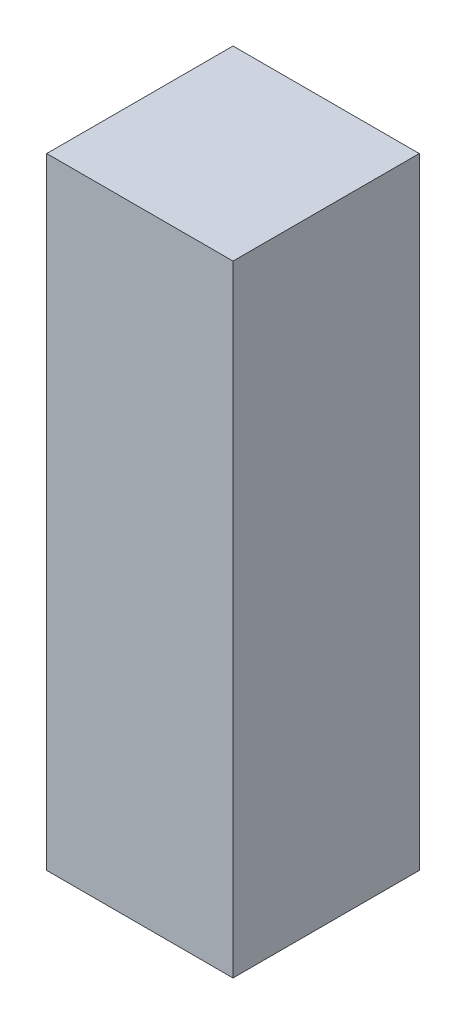
ISO-10303-21;
HEADER;
FILE_DESCRIPTION(('STEP AP214'),'2;1');
FILE_NAME('part.step','',(''),(''),'','','');
FILE_SCHEMA(('AUTOMOTIVE_DESIGN { 1 0 10303 214 1 1 1 1 }'));
ENDSEC;
DATA;
#1=APPLICATION_CONTEXT('core data for automotive mechanical design processes');
#2=APPLICATION_PROTOCOL_DEFINITION('international standard','automotive_design',2000,#1);
#3=PRODUCT_CONTEXT('',#1,'mechanical');
#4=PRODUCT('Part','Part','',(#3));
#5=PRODUCT_RELATED_PRODUCT_CATEGORY('part','',(#4));
#6=PRODUCT_DEFINITION_FORMATION('','',#4);
#7=PRODUCT_DEFINITION_CONTEXT('part definition',#1,'design');
#8=PRODUCT_DEFINITION('design','',#6,#7);
#9=PRODUCT_DEFINITION_SHAPE('','',#8);
#10=(LENGTH_UNIT() NAMED_UNIT(*) SI_UNIT(.MILLI.,.METRE.));
#11=(NAMED_UNIT(*) PLANE_ANGLE_UNIT() SI_UNIT($,.RADIAN.));
#12=(NAMED_UNIT(*) SI_UNIT($,.STERADIAN.) SOLID_ANGLE_UNIT());
#13=UNCERTAINTY_MEASURE_WITH_UNIT(LENGTH_MEASURE(1.E-05),#10,'distance_accuracy_value','');
#14=(GEOMETRIC_REPRESENTATION_CONTEXT(3) GLOBAL_UNCERTAINTY_ASSIGNED_CONTEXT((#13)) GLOBAL_UNIT_ASSIGNED_CONTEXT((#10,
#11,#12)) REPRESENTATION_CONTEXT('',''));
#15=CARTESIAN_POINT('',(0.,0.,0.));
#16=DIRECTION('',(0.,0.,1.));
#17=DIRECTION('',(1.,0.,0.));
#18=AXIS2_PLACEMENT_3D('',#15,#16,#17);
#19=CARTESIAN_POINT('',(-1.1,-0.6,1.305));
#20=DIRECTION('',(0.,-1.,0.));
#21=DIRECTION('',(0.,0.,-1.));
#22=AXIS2_PLACEMENT_3D('',#19,#20,#21);
#23=PLANE('',#22);
#24=DIRECTION('',(-1.,0.,0.));
#25=VECTOR('',#24,1.);
#26=CARTESIAN_POINT('',(-1.1,-0.6,1.605));
#27=LINE('',#26,#25);
#28=CARTESIAN_POINT('',(-1.1,-0.6,1.605));
#29=VERTEX_POINT('',#28);
#30=CARTESIAN_POINT('',(-1.4,-0.6,1.605));
#31=VERTEX_POINT('',#30);
#32=EDGE_CURVE('E69',#29,#31,#27,.T.);
#33=ORIENTED_EDGE('',*,*,#32,.T.);
#34=DIRECTION('',(0.,0.,-1.));
#35=VECTOR('',#34,1.);
#36=CARTESIAN_POINT('',(-1.4,-0.6,1.605));
#37=LINE('',#36,#35);
#38=CARTESIAN_POINT('',(-1.4,-0.6,1.305));
#39=VERTEX_POINT('',#38);
#40=EDGE_CURVE('E71',#31,#39,#37,.T.);
#41=ORIENTED_EDGE('',*,*,#40,.T.);
#42=DIRECTION('',(-1.,0.,0.));
#43=VECTOR('',#42,1.);
#44=CARTESIAN_POINT('',(-1.1,-0.6,1.305));
#45=LINE('',#44,#43);
#46=CARTESIAN_POINT('',(-1.1,-0.6,1.305));
#47=VERTEX_POINT('',#46);
#48=EDGE_CURVE('E11',#47,#39,#45,.T.);
#49=ORIENTED_EDGE('',*,*,#48,.F.);
#50=DIRECTION('',(0.,0.,-1.));
#51=VECTOR('',#50,1.);
#52=CARTESIAN_POINT('',(-1.1,-0.6,1.605));
#53=LINE('',#52,#51);
#54=EDGE_CURVE('E74',#29,#47,#53,.T.);
#55=ORIENTED_EDGE('',*,*,#54,.F.);
#56=EDGE_LOOP('',(#33,#41,#49,#55));
#57=FACE_BOUND('',#56,.T.);
#58=ADVANCED_FACE('F17',(#57),#23,.T.);
#59=CARTESIAN_POINT('',(0.,0.,1.305));
#60=DIRECTION('',(0.,0.,1.));
#61=DIRECTION('',(1.,0.,0.));
#62=AXIS2_PLACEMENT_3D('',#59,#60,#61);
#63=PLANE('',#62);
#64=DIRECTION('',(0.,-1.,0.));
#65=VECTOR('',#64,1.);
#66=CARTESIAN_POINT('',(-1.1,0.4,1.305));
#67=LINE('',#66,#65);
#68=CARTESIAN_POINT('',(-1.1,0.4,1.305));
#69=VERTEX_POINT('',#68);
#70=EDGE_CURVE('E111',#69,#47,#67,.T.);
#71=ORIENTED_EDGE('',*,*,#70,.T.);
#72=ORIENTED_EDGE('',*,*,#48,.T.);
#73=DIRECTION('',(0.,1.,0.));
#74=VECTOR('',#73,1.);
#75=CARTESIAN_POINT('',(-1.4,-0.6,1.305));
#76=LINE('',#75,#74);
#77=CARTESIAN_POINT('',(-1.4,0.4,1.305));
#78=VERTEX_POINT('',#77);
#79=EDGE_CURVE('E87',#39,#78,#76,.T.);
#80=ORIENTED_EDGE('',*,*,#79,.T.);
#81=DIRECTION('',(1.,0.,0.));
#82=VECTOR('',#81,1.);
#83=CARTESIAN_POINT('',(-1.4,0.4,1.305));
#84=LINE('',#83,#82);
#85=EDGE_CURVE('E26',#78,#69,#84,.T.);
#86=ORIENTED_EDGE('',*,*,#85,.T.);
#87=EDGE_LOOP('',(#71,#72,#80,#86));
#88=FACE_BOUND('',#87,.T.);
#89=ADVANCED_FACE('F122',(#88),#63,.F.);
#90=CARTESIAN_POINT('',(-1.1,0.4,1.305));
#91=DIRECTION('',(0.,1.,0.));
#92=DIRECTION('',(1.,0.,0.));
#93=AXIS2_PLACEMENT_3D('',#90,#91,#92);
#94=PLANE('',#93);
#95=DIRECTION('',(1.,0.,0.));
#96=VECTOR('',#95,1.);
#97=CARTESIAN_POINT('',(-1.4,0.4,1.605));
#98=LINE('',#97,#96);
#99=CARTESIAN_POINT('',(-1.4,0.4,1.605));
#100=VERTEX_POINT('',#99);
#101=CARTESIAN_POINT('',(-1.1,0.4,1.605));
#102=VERTEX_POINT('',#101);
#103=EDGE_CURVE('E80',#100,#102,#98,.T.);
#104=ORIENTED_EDGE('',*,*,#103,.T.);
#105=DIRECTION('',(0.,0.,-1.));
#106=VECTOR('',#105,1.);
#107=CARTESIAN_POINT('',(-1.1,0.4,1.605));
#108=LINE('',#107,#106);
#109=EDGE_CURVE('E20',#102,#69,#108,.T.);
#110=ORIENTED_EDGE('',*,*,#109,.T.);
#111=ORIENTED_EDGE('',*,*,#85,.F.);
#112=DIRECTION('',(0.,0.,-1.));
#113=VECTOR('',#112,1.);
#114=CARTESIAN_POINT('',(-1.4,0.4,1.605));
#115=LINE('',#114,#113);
#116=EDGE_CURVE('E95',#100,#78,#115,.T.);
#117=ORIENTED_EDGE('',*,*,#116,.F.);
#118=EDGE_LOOP('',(#104,#110,#111,#117));
#119=FACE_BOUND('',#118,.T.);
#120=ADVANCED_FACE('F121',(#119),#94,.T.);
#121=CARTESIAN_POINT('',(-1.1,-0.6,1.305));
#122=DIRECTION('',(1.,0.,0.));
#123=DIRECTION('',(0.,1.,0.));
#124=AXIS2_PLACEMENT_3D('',#121,#122,#123);
#125=PLANE('',#124);
#126=DIRECTION('',(0.,-1.,0.));
#127=VECTOR('',#126,1.);
#128=CARTESIAN_POINT('',(-1.1,0.4,1.605));
#129=LINE('',#128,#127);
#130=EDGE_CURVE('E89',#102,#29,#129,.T.);
#131=ORIENTED_EDGE('',*,*,#130,.T.);
#132=ORIENTED_EDGE('',*,*,#54,.T.);
#133=ORIENTED_EDGE('',*,*,#70,.F.);
#134=ORIENTED_EDGE('',*,*,#109,.F.);
#135=EDGE_LOOP('',(#131,#132,#133,#134));
#136=FACE_BOUND('',#135,.T.);
#137=ADVANCED_FACE('F118',(#136),#125,.T.);
#138=CARTESIAN_POINT('',(0.,0.,1.605));
#139=DIRECTION('',(0.,0.,1.));
#140=DIRECTION('',(1.,0.,0.));
#141=AXIS2_PLACEMENT_3D('',#138,#139,#140);
#142=PLANE('',#141);
#143=ORIENTED_EDGE('',*,*,#130,.F.);
#144=ORIENTED_EDGE('',*,*,#103,.F.);
#145=DIRECTION('',(0.,1.,0.));
#146=VECTOR('',#145,1.);
#147=CARTESIAN_POINT('',(-1.4,-0.6,1.605));
#148=LINE('',#147,#146);
#149=EDGE_CURVE('E86',#31,#100,#148,.T.);
#150=ORIENTED_EDGE('',*,*,#149,.F.);
#151=ORIENTED_EDGE('',*,*,#32,.F.);
#152=EDGE_LOOP('',(#143,#144,#150,#151));
#153=FACE_BOUND('',#152,.T.);
#154=ADVANCED_FACE('F91',(#153),#142,.T.);
#155=CARTESIAN_POINT('',(-1.4,-0.6,1.305));
#156=DIRECTION('',(-1.,0.,0.));
#157=DIRECTION('',(0.,0.,1.));
#158=AXIS2_PLACEMENT_3D('',#155,#156,#157);
#159=PLANE('',#158);
#160=ORIENTED_EDGE('',*,*,#149,.T.);
#161=ORIENTED_EDGE('',*,*,#116,.T.);
#162=ORIENTED_EDGE('',*,*,#79,.F.);
#163=ORIENTED_EDGE('',*,*,#40,.F.);
#164=EDGE_LOOP('',(#160,#161,#162,#163));
#165=FACE_BOUND('',#164,.T.);
#166=ADVANCED_FACE('F84',(#165),#159,.T.);
#167=CLOSED_SHELL('',(#58,#89,#120,#137,#154,#166));
#168=MANIFOLD_SOLID_BREP('B1',#167);
#169=ADVANCED_BREP_SHAPE_REPRESENTATION('',(#18,#168),#14);
#170=SHAPE_DEFINITION_REPRESENTATION(#9,#169);
ENDSEC;
END-ISO-10303-21;
